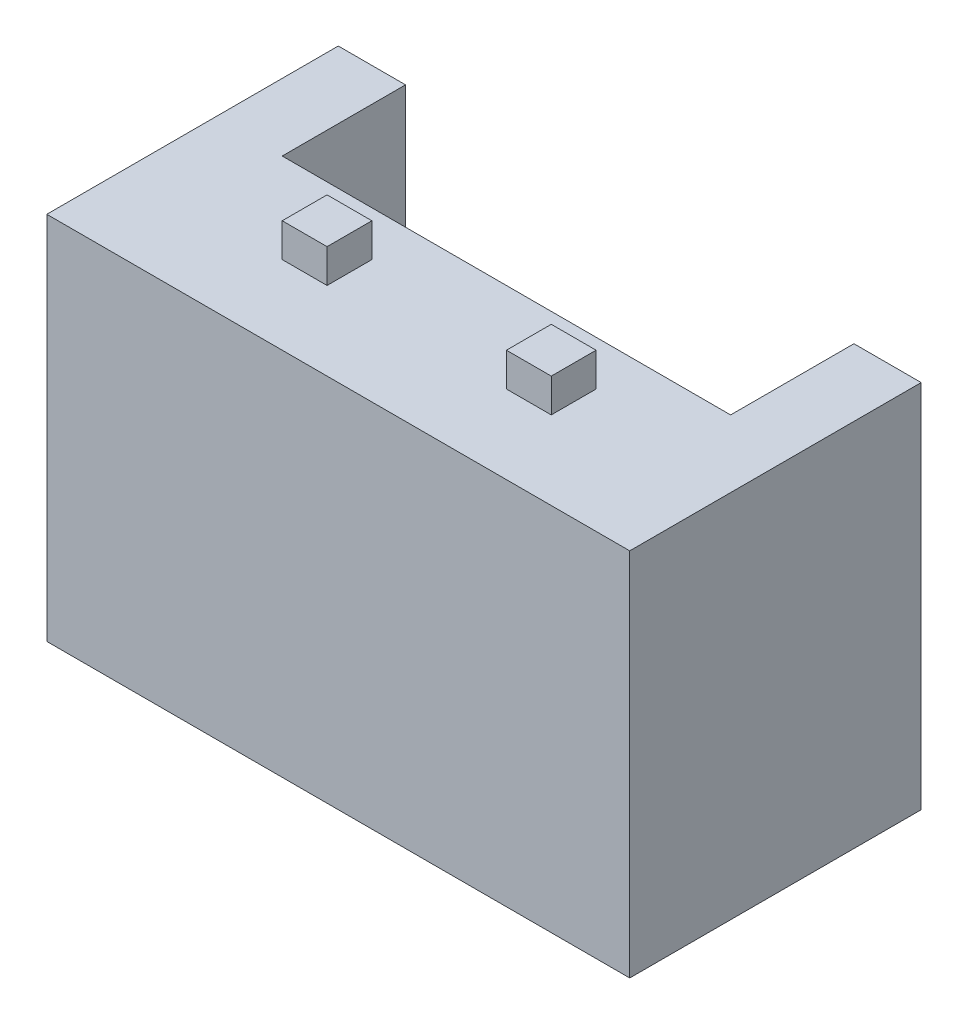
ISO-10303-21;
HEADER;
FILE_DESCRIPTION(('STEP AP214'),'2;1');
FILE_NAME('part.step','',(''),(''),'','','');
FILE_SCHEMA(('AUTOMOTIVE_DESIGN { 1 0 10303 214 1 1 1 1 }'));
ENDSEC;
DATA;
#1=APPLICATION_CONTEXT('core data for automotive mechanical design processes');
#2=APPLICATION_PROTOCOL_DEFINITION('international standard','automotive_design',2000,#1);
#3=PRODUCT_CONTEXT('',#1,'mechanical');
#4=PRODUCT('Part','Part','',(#3));
#5=PRODUCT_RELATED_PRODUCT_CATEGORY('part','',(#4));
#6=PRODUCT_DEFINITION_FORMATION('','',#4);
#7=PRODUCT_DEFINITION_CONTEXT('part definition',#1,'design');
#8=PRODUCT_DEFINITION('design','',#6,#7);
#9=PRODUCT_DEFINITION_SHAPE('','',#8);
#10=(LENGTH_UNIT() NAMED_UNIT(*) SI_UNIT(.MILLI.,.METRE.));
#11=(NAMED_UNIT(*) PLANE_ANGLE_UNIT() SI_UNIT($,.RADIAN.));
#12=(NAMED_UNIT(*) SI_UNIT($,.STERADIAN.) SOLID_ANGLE_UNIT());
#13=UNCERTAINTY_MEASURE_WITH_UNIT(LENGTH_MEASURE(1.E-05),#10,'distance_accuracy_value','');
#14=(GEOMETRIC_REPRESENTATION_CONTEXT(3) GLOBAL_UNCERTAINTY_ASSIGNED_CONTEXT((#13)) GLOBAL_UNIT_ASSIGNED_CONTEXT((#10,
#11,#12)) REPRESENTATION_CONTEXT('',''));
#15=CARTESIAN_POINT('',(0.,0.,0.));
#16=DIRECTION('',(0.,0.,1.));
#17=DIRECTION('',(1.,0.,0.));
#18=AXIS2_PLACEMENT_3D('',#15,#16,#17);
#19=CARTESIAN_POINT('',(0.,16.5,0.));
#20=DIRECTION('',(0.,-1.,0.));
#21=DIRECTION('',(0.,0.,-1.));
#22=AXIS2_PLACEMENT_3D('',#19,#20,#21);
#23=PLANE('',#22);
#24=DIRECTION('',(0.,0.,-1.));
#25=VECTOR('',#24,1.);
#26=CARTESIAN_POINT('',(-4.,16.5,1.));
#27=LINE('',#26,#25);
#28=CARTESIAN_POINT('',(-4.,16.5,3.));
#29=VERTEX_POINT('',#28);
#30=CARTESIAN_POINT('',(-4.,16.5,1.));
#31=VERTEX_POINT('',#30);
#32=EDGE_CURVE('E217',#29,#31,#27,.T.);
#33=ORIENTED_EDGE('',*,*,#32,.F.);
#34=DIRECTION('',(1.,0.,0.));
#35=VECTOR('',#34,1.);
#36=CARTESIAN_POINT('',(-6.,16.5,3.));
#37=LINE('',#36,#35);
#38=CARTESIAN_POINT('',(-6.,16.5,3.));
#39=VERTEX_POINT('',#38);
#40=EDGE_CURVE('E230',#39,#29,#37,.T.);
#41=ORIENTED_EDGE('',*,*,#40,.F.);
#42=DIRECTION('',(0.,0.,1.));
#43=VECTOR('',#42,1.);
#44=CARTESIAN_POINT('',(-6.,16.5,1.));
#45=LINE('',#44,#43);
#46=CARTESIAN_POINT('',(-6.,16.5,1.));
#47=VERTEX_POINT('',#46);
#48=EDGE_CURVE('E239',#47,#39,#45,.T.);
#49=ORIENTED_EDGE('',*,*,#48,.F.);
#50=DIRECTION('',(-1.,0.,0.));
#51=VECTOR('',#50,1.);
#52=CARTESIAN_POINT('',(-6.,16.5,1.));
#53=LINE('',#52,#51);
#54=EDGE_CURVE('E220',#31,#47,#53,.T.);
#55=ORIENTED_EDGE('',*,*,#54,.F.);
#56=EDGE_LOOP('',(#33,#41,#49,#55));
#57=FACE_BOUND('',#56,.T.);
#58=DIRECTION('',(0.,0.,1.));
#59=VECTOR('',#58,1.);
#60=CARTESIAN_POINT('',(-13.,16.5,-6.5));
#61=LINE('',#60,#59);
#62=CARTESIAN_POINT('',(-13.,16.5,-6.5));
#63=VERTEX_POINT('',#62);
#64=CARTESIAN_POINT('',(-13.,16.5,6.5));
#65=VERTEX_POINT('',#64);
#66=EDGE_CURVE('E315',#63,#65,#61,.T.);
#67=ORIENTED_EDGE('',*,*,#66,.T.);
#68=DIRECTION('',(1.,0.,0.));
#69=VECTOR('',#68,1.);
#70=CARTESIAN_POINT('',(13.,16.5,6.5));
#71=LINE('',#70,#69);
#72=CARTESIAN_POINT('',(13.,16.5,6.5));
#73=VERTEX_POINT('',#72);
#74=EDGE_CURVE('E318',#65,#73,#71,.T.);
#75=ORIENTED_EDGE('',*,*,#74,.T.);
#76=DIRECTION('',(0.,0.,-1.));
#77=VECTOR('',#76,1.);
#78=CARTESIAN_POINT('',(13.,16.5,-6.5));
#79=LINE('',#78,#77);
#80=CARTESIAN_POINT('',(13.,16.5,-6.5));
#81=VERTEX_POINT('',#80);
#82=EDGE_CURVE('E321',#73,#81,#79,.T.);
#83=ORIENTED_EDGE('',*,*,#82,.T.);
#84=DIRECTION('',(-1.,0.,0.));
#85=VECTOR('',#84,1.);
#86=CARTESIAN_POINT('',(10.,16.5,-6.5));
#87=LINE('',#86,#85);
#88=CARTESIAN_POINT('',(10.,16.5,-6.5));
#89=VERTEX_POINT('',#88);
#90=EDGE_CURVE('E323',#81,#89,#87,.T.);
#91=ORIENTED_EDGE('',*,*,#90,.T.);
#92=DIRECTION('',(0.,0.,1.));
#93=VECTOR('',#92,1.);
#94=CARTESIAN_POINT('',(10.,16.5,-1.));
#95=LINE('',#94,#93);
#96=CARTESIAN_POINT('',(10.,16.5,-1.));
#97=VERTEX_POINT('',#96);
#98=EDGE_CURVE('E325',#89,#97,#95,.T.);
#99=ORIENTED_EDGE('',*,*,#98,.T.);
#100=DIRECTION('',(-1.,0.,0.));
#101=VECTOR('',#100,1.);
#102=CARTESIAN_POINT('',(-10.,16.5,-1.));
#103=LINE('',#102,#101);
#104=CARTESIAN_POINT('',(-10.,16.5,-1.));
#105=VERTEX_POINT('',#104);
#106=EDGE_CURVE('E327',#97,#105,#103,.T.);
#107=ORIENTED_EDGE('',*,*,#106,.T.);
#108=DIRECTION('',(0.,0.,-1.));
#109=VECTOR('',#108,1.);
#110=CARTESIAN_POINT('',(-10.,16.5,-1.));
#111=LINE('',#110,#109);
#112=CARTESIAN_POINT('',(-10.,16.5,-6.5));
#113=VERTEX_POINT('',#112);
#114=EDGE_CURVE('E329',#105,#113,#111,.T.);
#115=ORIENTED_EDGE('',*,*,#114,.T.);
#116=DIRECTION('',(-1.,0.,0.));
#117=VECTOR('',#116,1.);
#118=CARTESIAN_POINT('',(-13.,16.5,-6.5));
#119=LINE('',#118,#117);
#120=EDGE_CURVE('E331',#113,#63,#119,.T.);
#121=ORIENTED_EDGE('',*,*,#120,.T.);
#122=EDGE_LOOP('',(#67,#75,#83,#91,#99,#107,#115,#121));
#123=FACE_BOUND('',#122,.T.);
#124=DIRECTION('',(0.,0.,-1.));
#125=VECTOR('',#124,1.);
#126=CARTESIAN_POINT('',(6.,16.5,1.));
#127=LINE('',#126,#125);
#128=CARTESIAN_POINT('',(6.,16.5,3.));
#129=VERTEX_POINT('',#128);
#130=CARTESIAN_POINT('',(6.,16.5,1.));
#131=VERTEX_POINT('',#130);
#132=EDGE_CURVE('E216',#129,#131,#127,.T.);
#133=ORIENTED_EDGE('',*,*,#132,.F.);
#134=DIRECTION('',(1.,0.,0.));
#135=VECTOR('',#134,1.);
#136=CARTESIAN_POINT('',(4.,16.5,3.));
#137=LINE('',#136,#135);
#138=CARTESIAN_POINT('',(4.,16.5,3.));
#139=VERTEX_POINT('',#138);
#140=EDGE_CURVE('E213',#139,#129,#137,.T.);
#141=ORIENTED_EDGE('',*,*,#140,.F.);
#142=DIRECTION('',(0.,0.,1.));
#143=VECTOR('',#142,1.);
#144=CARTESIAN_POINT('',(4.,16.5,1.));
#145=LINE('',#144,#143);
#146=CARTESIAN_POINT('',(4.,16.5,1.));
#147=VERTEX_POINT('',#146);
#148=EDGE_CURVE('E55',#147,#139,#145,.T.);
#149=ORIENTED_EDGE('',*,*,#148,.F.);
#150=DIRECTION('',(-1.,0.,0.));
#151=VECTOR('',#150,1.);
#152=CARTESIAN_POINT('',(4.,16.5,1.));
#153=LINE('',#152,#151);
#154=EDGE_CURVE('E50',#131,#147,#153,.T.);
#155=ORIENTED_EDGE('',*,*,#154,.F.);
#156=EDGE_LOOP('',(#133,#141,#149,#155));
#157=FACE_BOUND('',#156,.T.);
#158=ADVANCED_FACE('F35',(#57,#123,#157),#23,.F.);
#159=CARTESIAN_POINT('',(-13.,16.5,-6.5));
#160=DIRECTION('',(1.,0.,0.));
#161=DIRECTION('',(0.,0.,-1.));
#162=AXIS2_PLACEMENT_3D('',#159,#160,#161);
#163=PLANE('',#162);
#164=DIRECTION('',(0.,0.,1.));
#165=VECTOR('',#164,1.);
#166=CARTESIAN_POINT('',(-13.,0.,-6.5));
#167=LINE('',#166,#165);
#168=CARTESIAN_POINT('',(-13.,0.,-6.5));
#169=VERTEX_POINT('',#168);
#170=CARTESIAN_POINT('',(-13.,0.,6.5));
#171=VERTEX_POINT('',#170);
#172=EDGE_CURVE('E307',#169,#171,#167,.T.);
#173=ORIENTED_EDGE('',*,*,#172,.T.);
#174=DIRECTION('',(0.,-1.,0.));
#175=VECTOR('',#174,1.);
#176=CARTESIAN_POINT('',(-13.,16.5,6.5));
#177=LINE('',#176,#175);
#178=EDGE_CURVE('E11',#65,#171,#177,.T.);
#179=ORIENTED_EDGE('',*,*,#178,.F.);
#180=ORIENTED_EDGE('',*,*,#66,.F.);
#181=DIRECTION('',(0.,-1.,0.));
#182=VECTOR('',#181,1.);
#183=CARTESIAN_POINT('',(-13.,16.5,-6.5));
#184=LINE('',#183,#182);
#185=EDGE_CURVE('E333',#63,#169,#184,.T.);
#186=ORIENTED_EDGE('',*,*,#185,.T.);
#187=EDGE_LOOP('',(#173,#179,#180,#186));
#188=FACE_BOUND('',#187,.T.);
#189=ADVANCED_FACE('F37',(#188),#163,.F.);
#190=CARTESIAN_POINT('',(13.,16.5,6.5));
#191=DIRECTION('',(0.,0.,-1.));
#192=DIRECTION('',(-1.,0.,0.));
#193=AXIS2_PLACEMENT_3D('',#190,#191,#192);
#194=PLANE('',#193);
#195=DIRECTION('',(1.,0.,0.));
#196=VECTOR('',#195,1.);
#197=CARTESIAN_POINT('',(13.,0.,6.5));
#198=LINE('',#197,#196);
#199=CARTESIAN_POINT('',(13.,0.,6.5));
#200=VERTEX_POINT('',#199);
#201=EDGE_CURVE('E336',#171,#200,#198,.T.);
#202=ORIENTED_EDGE('',*,*,#201,.T.);
#203=DIRECTION('',(0.,-1.,0.));
#204=VECTOR('',#203,1.);
#205=CARTESIAN_POINT('',(13.,16.5,6.5));
#206=LINE('',#205,#204);
#207=EDGE_CURVE('E43',#73,#200,#206,.T.);
#208=ORIENTED_EDGE('',*,*,#207,.F.);
#209=ORIENTED_EDGE('',*,*,#74,.F.);
#210=ORIENTED_EDGE('',*,*,#178,.T.);
#211=EDGE_LOOP('',(#202,#208,#209,#210));
#212=FACE_BOUND('',#211,.T.);
#213=ADVANCED_FACE('F396',(#212),#194,.F.);
#214=CARTESIAN_POINT('',(13.,16.5,-6.5));
#215=DIRECTION('',(-1.,0.,0.));
#216=DIRECTION('',(0.,0.,1.));
#217=AXIS2_PLACEMENT_3D('',#214,#215,#216);
#218=PLANE('',#217);
#219=DIRECTION('',(0.,0.,-1.));
#220=VECTOR('',#219,1.);
#221=CARTESIAN_POINT('',(13.,0.,-6.5));
#222=LINE('',#221,#220);
#223=CARTESIAN_POINT('',(13.,0.,-6.5));
#224=VERTEX_POINT('',#223);
#225=EDGE_CURVE('E338',#200,#224,#222,.T.);
#226=ORIENTED_EDGE('',*,*,#225,.T.);
#227=DIRECTION('',(0.,-1.,0.));
#228=VECTOR('',#227,1.);
#229=CARTESIAN_POINT('',(13.,16.5,-6.5));
#230=LINE('',#229,#228);
#231=EDGE_CURVE('E366',#81,#224,#230,.T.);
#232=ORIENTED_EDGE('',*,*,#231,.F.);
#233=ORIENTED_EDGE('',*,*,#82,.F.);
#234=ORIENTED_EDGE('',*,*,#207,.T.);
#235=EDGE_LOOP('',(#226,#232,#233,#234));
#236=FACE_BOUND('',#235,.T.);
#237=ADVANCED_FACE('F373',(#236),#218,.F.);
#238=CARTESIAN_POINT('',(10.,16.5,-6.5));
#239=DIRECTION('',(0.,0.,1.));
#240=DIRECTION('',(1.,0.,0.));
#241=AXIS2_PLACEMENT_3D('',#238,#239,#240);
#242=PLANE('',#241);
#243=DIRECTION('',(-1.,0.,0.));
#244=VECTOR('',#243,1.);
#245=CARTESIAN_POINT('',(10.,0.,-6.5));
#246=LINE('',#245,#244);
#247=CARTESIAN_POINT('',(10.,0.,-6.5));
#248=VERTEX_POINT('',#247);
#249=EDGE_CURVE('E340',#224,#248,#246,.T.);
#250=ORIENTED_EDGE('',*,*,#249,.T.);
#251=DIRECTION('',(0.,-1.,0.));
#252=VECTOR('',#251,1.);
#253=CARTESIAN_POINT('',(10.,16.5,-6.5));
#254=LINE('',#253,#252);
#255=EDGE_CURVE('E363',#89,#248,#254,.T.);
#256=ORIENTED_EDGE('',*,*,#255,.F.);
#257=ORIENTED_EDGE('',*,*,#90,.F.);
#258=ORIENTED_EDGE('',*,*,#231,.T.);
#259=EDGE_LOOP('',(#250,#256,#257,#258));
#260=FACE_BOUND('',#259,.T.);
#261=ADVANCED_FACE('F385',(#260),#242,.F.);
#262=CARTESIAN_POINT('',(10.,16.5,-1.));
#263=DIRECTION('',(1.,0.,0.));
#264=DIRECTION('',(0.,0.,-1.));
#265=AXIS2_PLACEMENT_3D('',#262,#263,#264);
#266=PLANE('',#265);
#267=DIRECTION('',(0.,0.,1.));
#268=VECTOR('',#267,1.);
#269=CARTESIAN_POINT('',(10.,0.,-1.));
#270=LINE('',#269,#268);
#271=CARTESIAN_POINT('',(10.,0.,-1.));
#272=VERTEX_POINT('',#271);
#273=EDGE_CURVE('E342',#248,#272,#270,.T.);
#274=ORIENTED_EDGE('',*,*,#273,.T.);
#275=DIRECTION('',(0.,-1.,0.));
#276=VECTOR('',#275,1.);
#277=CARTESIAN_POINT('',(10.,16.5,-1.));
#278=LINE('',#277,#276);
#279=EDGE_CURVE('E360',#97,#272,#278,.T.);
#280=ORIENTED_EDGE('',*,*,#279,.F.);
#281=ORIENTED_EDGE('',*,*,#98,.F.);
#282=ORIENTED_EDGE('',*,*,#255,.T.);
#283=EDGE_LOOP('',(#274,#280,#281,#282));
#284=FACE_BOUND('',#283,.T.);
#285=ADVANCED_FACE('F389',(#284),#266,.F.);
#286=CARTESIAN_POINT('',(-10.,16.5,-1.));
#287=DIRECTION('',(0.,0.,1.));
#288=DIRECTION('',(1.,0.,0.));
#289=AXIS2_PLACEMENT_3D('',#286,#287,#288);
#290=PLANE('',#289);
#291=DIRECTION('',(-1.,0.,0.));
#292=VECTOR('',#291,1.);
#293=CARTESIAN_POINT('',(-10.,0.,-1.));
#294=LINE('',#293,#292);
#295=CARTESIAN_POINT('',(7.,0.,-1.));
#296=VERTEX_POINT('',#295);
#297=EDGE_CURVE('E345',#272,#296,#294,.T.);
#298=ORIENTED_EDGE('',*,*,#297,.T.);
#299=DIRECTION('',(0.,-1.,0.));
#300=VECTOR('',#299,1.);
#301=CARTESIAN_POINT('',(7.,2.,-1.));
#302=LINE('',#301,#300);
#303=CARTESIAN_POINT('',(7.,2.,-1.));
#304=VERTEX_POINT('',#303);
#305=EDGE_CURVE('E275',#304,#296,#302,.T.);
#306=ORIENTED_EDGE('',*,*,#305,.F.);
#307=DIRECTION('',(1.,0.,0.));
#308=VECTOR('',#307,1.);
#309=CARTESIAN_POINT('',(3.,2.,-1.));
#310=LINE('',#309,#308);
#311=CARTESIAN_POINT('',(3.,2.,-1.));
#312=VERTEX_POINT('',#311);
#313=EDGE_CURVE('E266',#312,#304,#310,.T.);
#314=ORIENTED_EDGE('',*,*,#313,.F.);
#315=DIRECTION('',(0.,-1.,0.));
#316=VECTOR('',#315,1.);
#317=CARTESIAN_POINT('',(3.,2.,-1.));
#318=LINE('',#317,#316);
#319=CARTESIAN_POINT('',(3.,0.,-1.));
#320=VERTEX_POINT('',#319);
#321=EDGE_CURVE('E278',#312,#320,#318,.T.);
#322=ORIENTED_EDGE('',*,*,#321,.T.);
#323=CARTESIAN_POINT('',(-3.,0.,-1.));
#324=VERTEX_POINT('',#323);
#325=EDGE_CURVE('E349',#320,#324,#294,.T.);
#326=ORIENTED_EDGE('',*,*,#325,.T.);
#327=DIRECTION('',(0.,-1.,0.));
#328=VECTOR('',#327,1.);
#329=CARTESIAN_POINT('',(-3.,2.,-1.));
#330=LINE('',#329,#328);
#331=CARTESIAN_POINT('',(-3.,2.,-1.));
#332=VERTEX_POINT('',#331);
#333=EDGE_CURVE('E304',#332,#324,#330,.T.);
#334=ORIENTED_EDGE('',*,*,#333,.F.);
#335=DIRECTION('',(1.,0.,0.));
#336=VECTOR('',#335,1.);
#337=CARTESIAN_POINT('',(-7.,2.,-1.));
#338=LINE('',#337,#336);
#339=CARTESIAN_POINT('',(-7.,2.,-1.));
#340=VERTEX_POINT('',#339);
#341=EDGE_CURVE('E295',#340,#332,#338,.T.);
#342=ORIENTED_EDGE('',*,*,#341,.F.);
#343=DIRECTION('',(0.,-1.,0.));
#344=VECTOR('',#343,1.);
#345=CARTESIAN_POINT('',(-7.,2.,-1.));
#346=LINE('',#345,#344);
#347=CARTESIAN_POINT('',(-7.,0.,-1.));
#348=VERTEX_POINT('',#347);
#349=EDGE_CURVE('E308',#340,#348,#346,.T.);
#350=ORIENTED_EDGE('',*,*,#349,.T.);
#351=CARTESIAN_POINT('',(-10.,0.,-1.));
#352=VERTEX_POINT('',#351);
#353=EDGE_CURVE('E344',#348,#352,#294,.T.);
#354=ORIENTED_EDGE('',*,*,#353,.T.);
#355=DIRECTION('',(0.,-1.,0.));
#356=VECTOR('',#355,1.);
#357=CARTESIAN_POINT('',(-10.,16.5,-1.));
#358=LINE('',#357,#356);
#359=EDGE_CURVE('E357',#105,#352,#358,.T.);
#360=ORIENTED_EDGE('',*,*,#359,.F.);
#361=ORIENTED_EDGE('',*,*,#106,.F.);
#362=ORIENTED_EDGE('',*,*,#279,.T.);
#363=EDGE_LOOP('',(#298,#306,#314,#322,#326,#334,#342,#350,#354,#360,#361,#362));
#364=FACE_BOUND('',#363,.T.);
#365=ADVANCED_FACE('F410',(#364),#290,.F.);
#366=CARTESIAN_POINT('',(-10.,16.5,-1.));
#367=DIRECTION('',(-1.,0.,0.));
#368=DIRECTION('',(0.,0.,1.));
#369=AXIS2_PLACEMENT_3D('',#366,#367,#368);
#370=PLANE('',#369);
#371=DIRECTION('',(0.,0.,-1.));
#372=VECTOR('',#371,1.);
#373=CARTESIAN_POINT('',(-10.,0.,-1.));
#374=LINE('',#373,#372);
#375=CARTESIAN_POINT('',(-10.,0.,-6.5));
#376=VERTEX_POINT('',#375);
#377=EDGE_CURVE('E348',#352,#376,#374,.T.);
#378=ORIENTED_EDGE('',*,*,#377,.T.);
#379=DIRECTION('',(0.,-1.,0.));
#380=VECTOR('',#379,1.);
#381=CARTESIAN_POINT('',(-10.,16.5,-6.5));
#382=LINE('',#381,#380);
#383=EDGE_CURVE('E354',#113,#376,#382,.T.);
#384=ORIENTED_EDGE('',*,*,#383,.F.);
#385=ORIENTED_EDGE('',*,*,#114,.F.);
#386=ORIENTED_EDGE('',*,*,#359,.T.);
#387=EDGE_LOOP('',(#378,#384,#385,#386));
#388=FACE_BOUND('',#387,.T.);
#389=ADVANCED_FACE('F408',(#388),#370,.F.);
#390=CARTESIAN_POINT('',(-13.,16.5,-6.5));
#391=DIRECTION('',(0.,0.,1.));
#392=DIRECTION('',(1.,0.,0.));
#393=AXIS2_PLACEMENT_3D('',#390,#391,#392);
#394=PLANE('',#393);
#395=DIRECTION('',(-1.,0.,0.));
#396=VECTOR('',#395,1.);
#397=CARTESIAN_POINT('',(-13.,0.,-6.5));
#398=LINE('',#397,#396);
#399=EDGE_CURVE('E319',#376,#169,#398,.T.);
#400=ORIENTED_EDGE('',*,*,#399,.T.);
#401=ORIENTED_EDGE('',*,*,#185,.F.);
#402=ORIENTED_EDGE('',*,*,#120,.F.);
#403=ORIENTED_EDGE('',*,*,#383,.T.);
#404=EDGE_LOOP('',(#400,#401,#402,#403));
#405=FACE_BOUND('',#404,.T.);
#406=ADVANCED_FACE('F403',(#405),#394,.F.);
#407=CARTESIAN_POINT('',(0.,0.,0.));
#408=DIRECTION('',(0.,-1.,0.));
#409=DIRECTION('',(0.,0.,-1.));
#410=AXIS2_PLACEMENT_3D('',#407,#408,#409);
#411=PLANE('',#410);
#412=DIRECTION('',(0.,0.,1.));
#413=VECTOR('',#412,1.);
#414=CARTESIAN_POINT('',(7.,0.,4.));
#415=LINE('',#414,#413);
#416=CARTESIAN_POINT('',(7.,0.,4.));
#417=VERTEX_POINT('',#416);
#418=EDGE_CURVE('E255',#296,#417,#415,.T.);
#419=ORIENTED_EDGE('',*,*,#418,.F.);
#420=ORIENTED_EDGE('',*,*,#297,.F.);
#421=ORIENTED_EDGE('',*,*,#273,.F.);
#422=ORIENTED_EDGE('',*,*,#249,.F.);
#423=ORIENTED_EDGE('',*,*,#225,.F.);
#424=ORIENTED_EDGE('',*,*,#201,.F.);
#425=ORIENTED_EDGE('',*,*,#172,.F.);
#426=ORIENTED_EDGE('',*,*,#399,.F.);
#427=ORIENTED_EDGE('',*,*,#377,.F.);
#428=ORIENTED_EDGE('',*,*,#353,.F.);
#429=DIRECTION('',(0.,0.,-1.));
#430=VECTOR('',#429,1.);
#431=CARTESIAN_POINT('',(-7.,0.,4.));
#432=LINE('',#431,#430);
#433=CARTESIAN_POINT('',(-7.,0.,4.));
#434=VERTEX_POINT('',#433);
#435=EDGE_CURVE('E289',#434,#348,#432,.T.);
#436=ORIENTED_EDGE('',*,*,#435,.F.);
#437=DIRECTION('',(-1.,0.,0.));
#438=VECTOR('',#437,1.);
#439=CARTESIAN_POINT('',(-7.,0.,4.));
#440=LINE('',#439,#438);
#441=CARTESIAN_POINT('',(-3.,0.,4.));
#442=VERTEX_POINT('',#441);
#443=EDGE_CURVE('E300',#442,#434,#440,.T.);
#444=ORIENTED_EDGE('',*,*,#443,.F.);
#445=DIRECTION('',(0.,0.,1.));
#446=VECTOR('',#445,1.);
#447=CARTESIAN_POINT('',(-3.,0.,4.));
#448=LINE('',#447,#446);
#449=EDGE_CURVE('E277',#324,#442,#448,.T.);
#450=ORIENTED_EDGE('',*,*,#449,.F.);
#451=ORIENTED_EDGE('',*,*,#325,.F.);
#452=DIRECTION('',(0.,0.,-1.));
#453=VECTOR('',#452,1.);
#454=CARTESIAN_POINT('',(3.,0.,4.));
#455=LINE('',#454,#453);
#456=CARTESIAN_POINT('',(3.,0.,4.));
#457=VERTEX_POINT('',#456);
#458=EDGE_CURVE('E260',#457,#320,#455,.T.);
#459=ORIENTED_EDGE('',*,*,#458,.F.);
#460=DIRECTION('',(-1.,0.,0.));
#461=VECTOR('',#460,1.);
#462=CARTESIAN_POINT('',(3.,0.,4.));
#463=LINE('',#462,#461);
#464=EDGE_CURVE('E271',#417,#457,#463,.T.);
#465=ORIENTED_EDGE('',*,*,#464,.F.);
#466=EDGE_LOOP('',(#419,#420,#421,#422,#423,#424,#425,#426,#427,#428,#436,#444,#450,#451,#459,#465));
#467=FACE_BOUND('',#466,.T.);
#468=ADVANCED_FACE('F379',(#467),#411,.T.);
#469=CARTESIAN_POINT('',(-3.,2.,4.));
#470=DIRECTION('',(1.,0.,0.));
#471=DIRECTION('',(0.,0.,-1.));
#472=AXIS2_PLACEMENT_3D('',#469,#470,#471);
#473=PLANE('',#472);
#474=ORIENTED_EDGE('',*,*,#449,.T.);
#475=DIRECTION('',(0.,-1.,0.));
#476=VECTOR('',#475,1.);
#477=CARTESIAN_POINT('',(-3.,2.,4.));
#478=LINE('',#477,#476);
#479=CARTESIAN_POINT('',(-3.,2.,4.));
#480=VERTEX_POINT('',#479);
#481=EDGE_CURVE('E298',#480,#442,#478,.T.);
#482=ORIENTED_EDGE('',*,*,#481,.F.);
#483=DIRECTION('',(0.,0.,1.));
#484=VECTOR('',#483,1.);
#485=CARTESIAN_POINT('',(-3.,2.,4.));
#486=LINE('',#485,#484);
#487=EDGE_CURVE('E285',#332,#480,#486,.T.);
#488=ORIENTED_EDGE('',*,*,#487,.F.);
#489=ORIENTED_EDGE('',*,*,#333,.T.);
#490=EDGE_LOOP('',(#474,#482,#488,#489));
#491=FACE_BOUND('',#490,.T.);
#492=ADVANCED_FACE('F419',(#491),#473,.F.);
#493=CARTESIAN_POINT('',(-7.,2.,4.));
#494=DIRECTION('',(-1.,0.,0.));
#495=DIRECTION('',(0.,0.,1.));
#496=AXIS2_PLACEMENT_3D('',#493,#494,#495);
#497=PLANE('',#496);
#498=ORIENTED_EDGE('',*,*,#435,.T.);
#499=ORIENTED_EDGE('',*,*,#349,.F.);
#500=DIRECTION('',(0.,0.,-1.));
#501=VECTOR('',#500,1.);
#502=CARTESIAN_POINT('',(-7.,2.,4.));
#503=LINE('',#502,#501);
#504=CARTESIAN_POINT('',(-7.,2.,4.));
#505=VERTEX_POINT('',#504);
#506=EDGE_CURVE('E292',#505,#340,#503,.T.);
#507=ORIENTED_EDGE('',*,*,#506,.F.);
#508=DIRECTION('',(0.,-1.,0.));
#509=VECTOR('',#508,1.);
#510=CARTESIAN_POINT('',(-7.,2.,4.));
#511=LINE('',#510,#509);
#512=EDGE_CURVE('E311',#505,#434,#511,.T.);
#513=ORIENTED_EDGE('',*,*,#512,.T.);
#514=EDGE_LOOP('',(#498,#499,#507,#513));
#515=FACE_BOUND('',#514,.T.);
#516=ADVANCED_FACE('F428',(#515),#497,.F.);
#517=CARTESIAN_POINT('',(-7.,2.,4.));
#518=DIRECTION('',(0.,0.,1.));
#519=DIRECTION('',(1.,0.,0.));
#520=AXIS2_PLACEMENT_3D('',#517,#518,#519);
#521=PLANE('',#520);
#522=ORIENTED_EDGE('',*,*,#443,.T.);
#523=ORIENTED_EDGE('',*,*,#512,.F.);
#524=DIRECTION('',(-1.,0.,0.));
#525=VECTOR('',#524,1.);
#526=CARTESIAN_POINT('',(-7.,2.,4.));
#527=LINE('',#526,#525);
#528=EDGE_CURVE('E288',#480,#505,#527,.T.);
#529=ORIENTED_EDGE('',*,*,#528,.F.);
#530=ORIENTED_EDGE('',*,*,#481,.T.);
#531=EDGE_LOOP('',(#522,#523,#529,#530));
#532=FACE_BOUND('',#531,.T.);
#533=ADVANCED_FACE('F422',(#532),#521,.F.);
#534=CARTESIAN_POINT('',(0.,2.,0.));
#535=DIRECTION('',(0.,-1.,0.));
#536=DIRECTION('',(0.,0.,-1.));
#537=AXIS2_PLACEMENT_3D('',#534,#535,#536);
#538=PLANE('',#537);
#539=ORIENTED_EDGE('',*,*,#487,.T.);
#540=ORIENTED_EDGE('',*,*,#528,.T.);
#541=ORIENTED_EDGE('',*,*,#506,.T.);
#542=ORIENTED_EDGE('',*,*,#341,.T.);
#543=EDGE_LOOP('',(#539,#540,#541,#542));
#544=FACE_BOUND('',#543,.T.);
#545=ADVANCED_FACE('F426',(#544),#538,.T.);
#546=CARTESIAN_POINT('',(7.,2.,4.));
#547=DIRECTION('',(1.,0.,0.));
#548=DIRECTION('',(0.,0.,-1.));
#549=AXIS2_PLACEMENT_3D('',#546,#547,#548);
#550=PLANE('',#549);
#551=ORIENTED_EDGE('',*,*,#418,.T.);
#552=DIRECTION('',(0.,-1.,0.));
#553=VECTOR('',#552,1.);
#554=CARTESIAN_POINT('',(7.,2.,4.));
#555=LINE('',#554,#553);
#556=CARTESIAN_POINT('',(7.,2.,4.));
#557=VERTEX_POINT('',#556);
#558=EDGE_CURVE('E269',#557,#417,#555,.T.);
#559=ORIENTED_EDGE('',*,*,#558,.F.);
#560=DIRECTION('',(0.,0.,1.));
#561=VECTOR('',#560,1.);
#562=CARTESIAN_POINT('',(7.,2.,4.));
#563=LINE('',#562,#561);
#564=EDGE_CURVE('E256',#304,#557,#563,.T.);
#565=ORIENTED_EDGE('',*,*,#564,.F.);
#566=ORIENTED_EDGE('',*,*,#305,.T.);
#567=EDGE_LOOP('',(#551,#559,#565,#566));
#568=FACE_BOUND('',#567,.T.);
#569=ADVANCED_FACE('F514',(#568),#550,.F.);
#570=CARTESIAN_POINT('',(3.,2.,4.));
#571=DIRECTION('',(-1.,0.,0.));
#572=DIRECTION('',(0.,0.,1.));
#573=AXIS2_PLACEMENT_3D('',#570,#571,#572);
#574=PLANE('',#573);
#575=ORIENTED_EDGE('',*,*,#458,.T.);
#576=ORIENTED_EDGE('',*,*,#321,.F.);
#577=DIRECTION('',(0.,0.,-1.));
#578=VECTOR('',#577,1.);
#579=CARTESIAN_POINT('',(3.,2.,4.));
#580=LINE('',#579,#578);
#581=CARTESIAN_POINT('',(3.,2.,4.));
#582=VERTEX_POINT('',#581);
#583=EDGE_CURVE('E263',#582,#312,#580,.T.);
#584=ORIENTED_EDGE('',*,*,#583,.F.);
#585=DIRECTION('',(0.,-1.,0.));
#586=VECTOR('',#585,1.);
#587=CARTESIAN_POINT('',(3.,2.,4.));
#588=LINE('',#587,#586);
#589=EDGE_CURVE('E281',#582,#457,#588,.T.);
#590=ORIENTED_EDGE('',*,*,#589,.T.);
#591=EDGE_LOOP('',(#575,#576,#584,#590));
#592=FACE_BOUND('',#591,.T.);
#593=ADVANCED_FACE('F522',(#592),#574,.F.);
#594=CARTESIAN_POINT('',(3.,2.,4.));
#595=DIRECTION('',(0.,0.,1.));
#596=DIRECTION('',(1.,0.,0.));
#597=AXIS2_PLACEMENT_3D('',#594,#595,#596);
#598=PLANE('',#597);
#599=ORIENTED_EDGE('',*,*,#464,.T.);
#600=ORIENTED_EDGE('',*,*,#589,.F.);
#601=DIRECTION('',(-1.,0.,0.));
#602=VECTOR('',#601,1.);
#603=CARTESIAN_POINT('',(3.,2.,4.));
#604=LINE('',#603,#602);
#605=EDGE_CURVE('E259',#557,#582,#604,.T.);
#606=ORIENTED_EDGE('',*,*,#605,.F.);
#607=ORIENTED_EDGE('',*,*,#558,.T.);
#608=EDGE_LOOP('',(#599,#600,#606,#607));
#609=FACE_BOUND('',#608,.T.);
#610=ADVANCED_FACE('F532',(#609),#598,.F.);
#611=CARTESIAN_POINT('',(0.,2.,0.));
#612=DIRECTION('',(0.,-1.,0.));
#613=DIRECTION('',(0.,0.,-1.));
#614=AXIS2_PLACEMENT_3D('',#611,#612,#613);
#615=PLANE('',#614);
#616=ORIENTED_EDGE('',*,*,#564,.T.);
#617=ORIENTED_EDGE('',*,*,#605,.T.);
#618=ORIENTED_EDGE('',*,*,#583,.T.);
#619=ORIENTED_EDGE('',*,*,#313,.T.);
#620=EDGE_LOOP('',(#616,#617,#618,#619));
#621=FACE_BOUND('',#620,.T.);
#622=ADVANCED_FACE('F542',(#621),#615,.T.);
#623=CARTESIAN_POINT('',(-4.,18.,1.));
#624=DIRECTION('',(-1.,0.,0.));
#625=DIRECTION('',(0.,0.,1.));
#626=AXIS2_PLACEMENT_3D('',#623,#624,#625);
#627=PLANE('',#626);
#628=ORIENTED_EDGE('',*,*,#32,.T.);
#629=DIRECTION('',(0.,-1.,0.));
#630=VECTOR('',#629,1.);
#631=CARTESIAN_POINT('',(-4.,18.,1.));
#632=LINE('',#631,#630);
#633=CARTESIAN_POINT('',(-4.,18.,1.));
#634=VERTEX_POINT('',#633);
#635=EDGE_CURVE('E252',#634,#31,#632,.T.);
#636=ORIENTED_EDGE('',*,*,#635,.F.);
#637=DIRECTION('',(0.,0.,-1.));
#638=VECTOR('',#637,1.);
#639=CARTESIAN_POINT('',(-4.,18.,1.));
#640=LINE('',#639,#638);
#641=CARTESIAN_POINT('',(-4.,18.,3.));
#642=VERTEX_POINT('',#641);
#643=EDGE_CURVE('E226',#642,#634,#640,.T.);
#644=ORIENTED_EDGE('',*,*,#643,.F.);
#645=DIRECTION('',(0.,-1.,0.));
#646=VECTOR('',#645,1.);
#647=CARTESIAN_POINT('',(-4.,18.,3.));
#648=LINE('',#647,#646);
#649=EDGE_CURVE('E235',#642,#29,#648,.T.);
#650=ORIENTED_EDGE('',*,*,#649,.T.);
#651=EDGE_LOOP('',(#628,#636,#644,#650));
#652=FACE_BOUND('',#651,.T.);
#653=ADVANCED_FACE('F551',(#652),#627,.F.);
#654=CARTESIAN_POINT('',(-6.,18.,1.));
#655=DIRECTION('',(0.,0.,1.));
#656=DIRECTION('',(1.,0.,0.));
#657=AXIS2_PLACEMENT_3D('',#654,#655,#656);
#658=PLANE('',#657);
#659=ORIENTED_EDGE('',*,*,#54,.T.);
#660=DIRECTION('',(0.,-1.,0.));
#661=VECTOR('',#660,1.);
#662=CARTESIAN_POINT('',(-6.,18.,1.));
#663=LINE('',#662,#661);
#664=CARTESIAN_POINT('',(-6.,18.,1.));
#665=VERTEX_POINT('',#664);
#666=EDGE_CURVE('E249',#665,#47,#663,.T.);
#667=ORIENTED_EDGE('',*,*,#666,.F.);
#668=DIRECTION('',(-1.,0.,0.));
#669=VECTOR('',#668,1.);
#670=CARTESIAN_POINT('',(-6.,18.,1.));
#671=LINE('',#670,#669);
#672=EDGE_CURVE('E229',#634,#665,#671,.T.);
#673=ORIENTED_EDGE('',*,*,#672,.F.);
#674=ORIENTED_EDGE('',*,*,#635,.T.);
#675=EDGE_LOOP('',(#659,#667,#673,#674));
#676=FACE_BOUND('',#675,.T.);
#677=ADVANCED_FACE('F566',(#676),#658,.F.);
#678=CARTESIAN_POINT('',(-6.,18.,1.));
#679=DIRECTION('',(1.,0.,0.));
#680=DIRECTION('',(0.,0.,-1.));
#681=AXIS2_PLACEMENT_3D('',#678,#679,#680);
#682=PLANE('',#681);
#683=ORIENTED_EDGE('',*,*,#48,.T.);
#684=DIRECTION('',(0.,-1.,0.));
#685=VECTOR('',#684,1.);
#686=CARTESIAN_POINT('',(-6.,18.,3.));
#687=LINE('',#686,#685);
#688=CARTESIAN_POINT('',(-6.,18.,3.));
#689=VERTEX_POINT('',#688);
#690=EDGE_CURVE('E246',#689,#39,#687,.T.);
#691=ORIENTED_EDGE('',*,*,#690,.F.);
#692=DIRECTION('',(0.,0.,1.));
#693=VECTOR('',#692,1.);
#694=CARTESIAN_POINT('',(-6.,18.,1.));
#695=LINE('',#694,#693);
#696=EDGE_CURVE('E232',#665,#689,#695,.T.);
#697=ORIENTED_EDGE('',*,*,#696,.F.);
#698=ORIENTED_EDGE('',*,*,#666,.T.);
#699=EDGE_LOOP('',(#683,#691,#697,#698));
#700=FACE_BOUND('',#699,.T.);
#701=ADVANCED_FACE('F576',(#700),#682,.F.);
#702=CARTESIAN_POINT('',(-6.,18.,3.));
#703=DIRECTION('',(0.,0.,-1.));
#704=DIRECTION('',(-1.,0.,0.));
#705=AXIS2_PLACEMENT_3D('',#702,#703,#704);
#706=PLANE('',#705);
#707=ORIENTED_EDGE('',*,*,#40,.T.);
#708=ORIENTED_EDGE('',*,*,#649,.F.);
#709=DIRECTION('',(1.,0.,0.));
#710=VECTOR('',#709,1.);
#711=CARTESIAN_POINT('',(-6.,18.,3.));
#712=LINE('',#711,#710);
#713=EDGE_CURVE('E234',#689,#642,#712,.T.);
#714=ORIENTED_EDGE('',*,*,#713,.F.);
#715=ORIENTED_EDGE('',*,*,#690,.T.);
#716=EDGE_LOOP('',(#707,#708,#714,#715));
#717=FACE_BOUND('',#716,.T.);
#718=ADVANCED_FACE('F586',(#717),#706,.F.);
#719=CARTESIAN_POINT('',(0.,18.,0.));
#720=DIRECTION('',(0.,1.,0.));
#721=DIRECTION('',(0.,0.,1.));
#722=AXIS2_PLACEMENT_3D('',#719,#720,#721);
#723=PLANE('',#722);
#724=ORIENTED_EDGE('',*,*,#643,.T.);
#725=ORIENTED_EDGE('',*,*,#672,.T.);
#726=ORIENTED_EDGE('',*,*,#696,.T.);
#727=ORIENTED_EDGE('',*,*,#713,.T.);
#728=EDGE_LOOP('',(#724,#725,#726,#727));
#729=FACE_BOUND('',#728,.T.);
#730=ADVANCED_FACE('F596',(#729),#723,.T.);
#731=CARTESIAN_POINT('',(6.,18.,1.));
#732=DIRECTION('',(-1.,0.,0.));
#733=DIRECTION('',(0.,0.,1.));
#734=AXIS2_PLACEMENT_3D('',#731,#732,#733);
#735=PLANE('',#734);
#736=ORIENTED_EDGE('',*,*,#132,.T.);
#737=DIRECTION('',(0.,-1.,0.));
#738=VECTOR('',#737,1.);
#739=CARTESIAN_POINT('',(6.,18.,1.));
#740=LINE('',#739,#738);
#741=CARTESIAN_POINT('',(6.,18.,1.));
#742=VERTEX_POINT('',#741);
#743=EDGE_CURVE('E197',#742,#131,#740,.T.);
#744=ORIENTED_EDGE('',*,*,#743,.F.);
#745=DIRECTION('',(0.,0.,-1.));
#746=VECTOR('',#745,1.);
#747=CARTESIAN_POINT('',(6.,18.,1.));
#748=LINE('',#747,#746);
#749=CARTESIAN_POINT('',(6.,18.,3.));
#750=VERTEX_POINT('',#749);
#751=EDGE_CURVE('E204',#750,#742,#748,.T.);
#752=ORIENTED_EDGE('',*,*,#751,.F.);
#753=DIRECTION('',(0.,-1.,0.));
#754=VECTOR('',#753,1.);
#755=CARTESIAN_POINT('',(6.,18.,3.));
#756=LINE('',#755,#754);
#757=EDGE_CURVE('E656',#750,#129,#756,.T.);
#758=ORIENTED_EDGE('',*,*,#757,.T.);
#759=EDGE_LOOP('',(#736,#744,#752,#758));
#760=FACE_BOUND('',#759,.T.);
#761=ADVANCED_FACE('F215',(#760),#735,.F.);
#762=CARTESIAN_POINT('',(4.,18.,1.));
#763=DIRECTION('',(0.,0.,1.));
#764=DIRECTION('',(1.,0.,0.));
#765=AXIS2_PLACEMENT_3D('',#762,#763,#764);
#766=PLANE('',#765);
#767=ORIENTED_EDGE('',*,*,#154,.T.);
#768=DIRECTION('',(0.,-1.,0.));
#769=VECTOR('',#768,1.);
#770=CARTESIAN_POINT('',(4.,18.,1.));
#771=LINE('',#770,#769);
#772=CARTESIAN_POINT('',(4.,18.,1.));
#773=VERTEX_POINT('',#772);
#774=EDGE_CURVE('E200',#773,#147,#771,.T.);
#775=ORIENTED_EDGE('',*,*,#774,.F.);
#776=DIRECTION('',(-1.,0.,0.));
#777=VECTOR('',#776,1.);
#778=CARTESIAN_POINT('',(4.,18.,1.));
#779=LINE('',#778,#777);
#780=EDGE_CURVE('E193',#742,#773,#779,.T.);
#781=ORIENTED_EDGE('',*,*,#780,.F.);
#782=ORIENTED_EDGE('',*,*,#743,.T.);
#783=EDGE_LOOP('',(#767,#775,#781,#782));
#784=FACE_BOUND('',#783,.T.);
#785=ADVANCED_FACE('F195',(#784),#766,.F.);
#786=CARTESIAN_POINT('',(4.,18.,1.));
#787=DIRECTION('',(1.,0.,0.));
#788=DIRECTION('',(0.,0.,-1.));
#789=AXIS2_PLACEMENT_3D('',#786,#787,#788);
#790=PLANE('',#789);
#791=ORIENTED_EDGE('',*,*,#148,.T.);
#792=DIRECTION('',(0.,-1.,0.));
#793=VECTOR('',#792,1.);
#794=CARTESIAN_POINT('',(4.,18.,3.));
#795=LINE('',#794,#793);
#796=CARTESIAN_POINT('',(4.,18.,3.));
#797=VERTEX_POINT('',#796);
#798=EDGE_CURVE('E222',#797,#139,#795,.T.);
#799=ORIENTED_EDGE('',*,*,#798,.F.);
#800=DIRECTION('',(0.,0.,1.));
#801=VECTOR('',#800,1.);
#802=CARTESIAN_POINT('',(4.,18.,1.));
#803=LINE('',#802,#801);
#804=EDGE_CURVE('E203',#773,#797,#803,.T.);
#805=ORIENTED_EDGE('',*,*,#804,.F.);
#806=ORIENTED_EDGE('',*,*,#774,.T.);
#807=EDGE_LOOP('',(#791,#799,#805,#806));
#808=FACE_BOUND('',#807,.T.);
#809=ADVANCED_FACE('F623',(#808),#790,.F.);
#810=CARTESIAN_POINT('',(4.,18.,3.));
#811=DIRECTION('',(0.,0.,-1.));
#812=DIRECTION('',(-1.,0.,0.));
#813=AXIS2_PLACEMENT_3D('',#810,#811,#812);
#814=PLANE('',#813);
#815=ORIENTED_EDGE('',*,*,#140,.T.);
#816=ORIENTED_EDGE('',*,*,#757,.F.);
#817=DIRECTION('',(1.,0.,0.));
#818=VECTOR('',#817,1.);
#819=CARTESIAN_POINT('',(4.,18.,3.));
#820=LINE('',#819,#818);
#821=EDGE_CURVE('E209',#797,#750,#820,.T.);
#822=ORIENTED_EDGE('',*,*,#821,.F.);
#823=ORIENTED_EDGE('',*,*,#798,.T.);
#824=EDGE_LOOP('',(#815,#816,#822,#823));
#825=FACE_BOUND('',#824,.T.);
#826=ADVANCED_FACE('F632',(#825),#814,.F.);
#827=CARTESIAN_POINT('',(0.,18.,0.));
#828=DIRECTION('',(0.,1.,0.));
#829=DIRECTION('',(0.,0.,1.));
#830=AXIS2_PLACEMENT_3D('',#827,#828,#829);
#831=PLANE('',#830);
#832=ORIENTED_EDGE('',*,*,#751,.T.);
#833=ORIENTED_EDGE('',*,*,#780,.T.);
#834=ORIENTED_EDGE('',*,*,#804,.T.);
#835=ORIENTED_EDGE('',*,*,#821,.T.);
#836=EDGE_LOOP('',(#832,#833,#834,#835));
#837=FACE_BOUND('',#836,.T.);
#838=ADVANCED_FACE('F207',(#837),#831,.T.);
#839=CLOSED_SHELL('',(#158,#189,#213,#237,#261,#285,#365,#389,#406,#468,#492,#516,#533,#545,
#569,#593,#610,#622,#653,#677,#701,#718,#730,#761,#785,#809,#826,#838));
#840=MANIFOLD_SOLID_BREP('B2',#839);
#841=ADVANCED_BREP_SHAPE_REPRESENTATION('',(#18,#840),#14);
#842=SHAPE_DEFINITION_REPRESENTATION(#9,#841);
ENDSEC;
END-ISO-10303-21;
